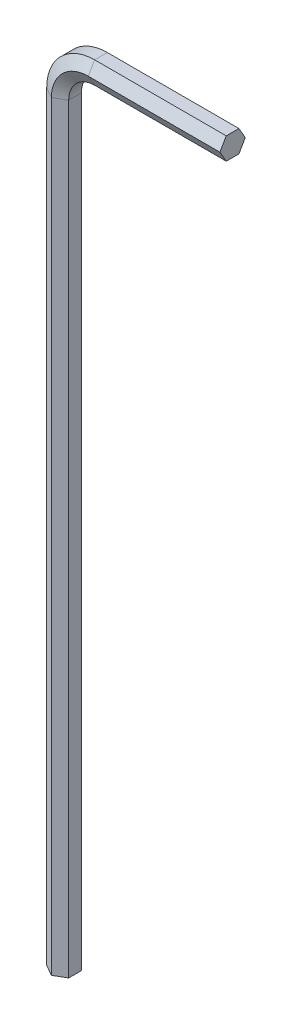
ISO-10303-21;
HEADER;
FILE_DESCRIPTION(('STEP AP214'),'2;1');
FILE_NAME('part.step','',(''),(''),'','','');
FILE_SCHEMA(('AUTOMOTIVE_DESIGN { 1 0 10303 214 1 1 1 1 }'));
ENDSEC;
DATA;
#1=APPLICATION_CONTEXT('core data for automotive mechanical design processes');
#2=APPLICATION_PROTOCOL_DEFINITION('international standard','automotive_design',2000,#1);
#3=PRODUCT_CONTEXT('',#1,'mechanical');
#4=PRODUCT('Part','Part','',(#3));
#5=PRODUCT_RELATED_PRODUCT_CATEGORY('part','',(#4));
#6=PRODUCT_DEFINITION_FORMATION('','',#4);
#7=PRODUCT_DEFINITION_CONTEXT('part definition',#1,'design');
#8=PRODUCT_DEFINITION('design','',#6,#7);
#9=PRODUCT_DEFINITION_SHAPE('','',#8);
#10=(LENGTH_UNIT() NAMED_UNIT(*) SI_UNIT(.MILLI.,.METRE.));
#11=(NAMED_UNIT(*) PLANE_ANGLE_UNIT() SI_UNIT($,.RADIAN.));
#12=(NAMED_UNIT(*) SI_UNIT($,.STERADIAN.) SOLID_ANGLE_UNIT());
#13=UNCERTAINTY_MEASURE_WITH_UNIT(LENGTH_MEASURE(1.E-05),#10,'distance_accuracy_value','');
#14=(GEOMETRIC_REPRESENTATION_CONTEXT(3) GLOBAL_UNCERTAINTY_ASSIGNED_CONTEXT((#13)) GLOBAL_UNIT_ASSIGNED_CONTEXT((#10,
#11,#12)) REPRESENTATION_CONTEXT('',''));
#15=CARTESIAN_POINT('',(0.,0.,0.));
#16=DIRECTION('',(0.,0.,1.));
#17=DIRECTION('',(1.,0.,0.));
#18=AXIS2_PLACEMENT_3D('',#15,#16,#17);
#19=CARTESIAN_POINT('',(4.00000000000003,86.31001,-1.37408209366592));
#20=DIRECTION('',(0.,0.500000000000001,-0.866025403784438));
#21=DIRECTION('',(0.,0.866025403784438,0.500000000000001));
#22=AXIS2_PLACEMENT_3D('',#19,#20,#21);
#23=PLANE('',#22);
#24=DIRECTION('',(0.,0.866025403784438,0.500000000000001));
#25=VECTOR('',#24,1.);
#26=CARTESIAN_POINT('',(4.00000000000003,86.31001,-1.37408209366592));
#27=LINE('',#26,#25);
#28=CARTESIAN_POINT('',(4.00000000000003,86.31001,-1.37408209366592));
#29=VERTEX_POINT('',#28);
#30=CARTESIAN_POINT('',(4.00000000000005,87.5,-0.687041046832959));
#31=VERTEX_POINT('',#30);
#32=EDGE_CURVE('E131',#29,#31,#27,.T.);
#33=ORIENTED_EDGE('',*,*,#32,.T.);
#34=DIRECTION('',(1.,0.,0.));
#35=VECTOR('',#34,1.);
#36=CARTESIAN_POINT('',(4.00000000000005,87.5,-0.687041046832959));
#37=LINE('',#36,#35);
#38=CARTESIAN_POINT('',(18.25001,87.5,-0.687041046832959));
#39=VERTEX_POINT('',#38);
#40=EDGE_CURVE('E40',#31,#39,#37,.T.);
#41=ORIENTED_EDGE('',*,*,#40,.T.);
#42=DIRECTION('',(0.,0.866025403784438,0.500000000000001));
#43=VECTOR('',#42,1.);
#44=CARTESIAN_POINT('',(18.25001,86.31001,-1.37408209366592));
#45=LINE('',#44,#43);
#46=CARTESIAN_POINT('',(18.25001,86.31001,-1.37408209366592));
#47=VERTEX_POINT('',#46);
#48=EDGE_CURVE('E47',#47,#39,#45,.T.);
#49=ORIENTED_EDGE('',*,*,#48,.F.);
#50=DIRECTION('',(1.,0.,0.));
#51=VECTOR('',#50,1.);
#52=CARTESIAN_POINT('',(4.00000000000003,86.31001,-1.37408209366592));
#53=LINE('',#52,#51);
#54=EDGE_CURVE('E11',#29,#47,#53,.T.);
#55=ORIENTED_EDGE('',*,*,#54,.F.);
#56=EDGE_LOOP('',(#33,#41,#49,#55));
#57=FACE_BOUND('',#56,.T.);
#58=ADVANCED_FACE('F33',(#57),#23,.T.);
#59=CARTESIAN_POINT('',(4.00000000000005,87.5,-0.687041046832959));
#60=DIRECTION('',(0.,1.,0.));
#61=DIRECTION('',(0.,0.,1.));
#62=AXIS2_PLACEMENT_3D('',#59,#60,#61);
#63=PLANE('',#62);
#64=DIRECTION('',(0.,0.,1.));
#65=VECTOR('',#64,1.);
#66=CARTESIAN_POINT('',(4.00000000000005,87.5,-0.687041046832959));
#67=LINE('',#66,#65);
#68=CARTESIAN_POINT('',(4.00000000000005,87.5,0.687041046832968));
#69=VERTEX_POINT('',#68);
#70=EDGE_CURVE('E178',#31,#69,#67,.T.);
#71=ORIENTED_EDGE('',*,*,#70,.T.);
#72=DIRECTION('',(1.,0.,0.));
#73=VECTOR('',#72,1.);
#74=CARTESIAN_POINT('',(4.00000000000005,87.5,0.687041046832968));
#75=LINE('',#74,#73);
#76=CARTESIAN_POINT('',(18.25001,87.5,0.687041046832968));
#77=VERTEX_POINT('',#76);
#78=EDGE_CURVE('E214',#69,#77,#75,.T.);
#79=ORIENTED_EDGE('',*,*,#78,.T.);
#80=DIRECTION('',(0.,0.,1.));
#81=VECTOR('',#80,1.);
#82=CARTESIAN_POINT('',(18.25001,87.5,-0.687041046832959));
#83=LINE('',#82,#81);
#84=EDGE_CURVE('E55',#39,#77,#83,.T.);
#85=ORIENTED_EDGE('',*,*,#84,.F.);
#86=ORIENTED_EDGE('',*,*,#40,.F.);
#87=EDGE_LOOP('',(#71,#79,#85,#86));
#88=FACE_BOUND('',#87,.T.);
#89=ADVANCED_FACE('F216',(#88),#63,.T.);
#90=CARTESIAN_POINT('',(4.00000000000005,87.5,0.687041046832968));
#91=DIRECTION('',(0.,0.499999999999995,0.866025403784441));
#92=DIRECTION('',(0.,-0.866025403784442,0.499999999999995));
#93=AXIS2_PLACEMENT_3D('',#90,#91,#92);
#94=PLANE('',#93);
#95=DIRECTION('',(0.,-0.866025403784442,0.499999999999995));
#96=VECTOR('',#95,1.);
#97=CARTESIAN_POINT('',(4.00000000000005,87.5,0.687041046832968));
#98=LINE('',#97,#96);
#99=CARTESIAN_POINT('',(4.00000000000003,86.31001,1.37408209366592));
#100=VERTEX_POINT('',#99);
#101=EDGE_CURVE('E175',#69,#100,#98,.T.);
#102=ORIENTED_EDGE('',*,*,#101,.T.);
#103=DIRECTION('',(1.,0.,0.));
#104=VECTOR('',#103,1.);
#105=CARTESIAN_POINT('',(4.00000000000003,86.31001,1.37408209366592));
#106=LINE('',#105,#104);
#107=CARTESIAN_POINT('',(18.25001,86.31001,1.37408209366592));
#108=VERTEX_POINT('',#107);
#109=EDGE_CURVE('E211',#100,#108,#106,.T.);
#110=ORIENTED_EDGE('',*,*,#109,.T.);
#111=DIRECTION('',(0.,-0.866025403784442,0.499999999999995));
#112=VECTOR('',#111,1.);
#113=CARTESIAN_POINT('',(18.25001,87.5,0.687041046832968));
#114=LINE('',#113,#112);
#115=EDGE_CURVE('E200',#77,#108,#114,.T.);
#116=ORIENTED_EDGE('',*,*,#115,.F.);
#117=ORIENTED_EDGE('',*,*,#78,.F.);
#118=EDGE_LOOP('',(#102,#110,#116,#117));
#119=FACE_BOUND('',#118,.T.);
#120=ADVANCED_FACE('F281',(#119),#94,.T.);
#121=CARTESIAN_POINT('',(4.00000000000003,86.31001,1.37408209366592));
#122=DIRECTION('',(0.,-0.500000000000007,0.866025403784435));
#123=DIRECTION('',(0.,-0.866025403784435,-0.500000000000007));
#124=AXIS2_PLACEMENT_3D('',#121,#122,#123);
#125=PLANE('',#124);
#126=DIRECTION('',(0.,-0.866025403784435,-0.500000000000007));
#127=VECTOR('',#126,1.);
#128=CARTESIAN_POINT('',(4.00000000000003,86.31001,1.37408209366592));
#129=LINE('',#128,#127);
#130=CARTESIAN_POINT('',(4.00000000000002,85.12002,0.687041046832951));
#131=VERTEX_POINT('',#130);
#132=EDGE_CURVE('E172',#100,#131,#129,.T.);
#133=ORIENTED_EDGE('',*,*,#132,.T.);
#134=DIRECTION('',(1.,0.,0.));
#135=VECTOR('',#134,1.);
#136=CARTESIAN_POINT('',(4.00000000000002,85.12002,0.687041046832951));
#137=LINE('',#136,#135);
#138=CARTESIAN_POINT('',(18.25001,85.12002,0.687041046832951));
#139=VERTEX_POINT('',#138);
#140=EDGE_CURVE('E208',#131,#139,#137,.T.);
#141=ORIENTED_EDGE('',*,*,#140,.T.);
#142=DIRECTION('',(0.,-0.866025403784435,-0.500000000000007));
#143=VECTOR('',#142,1.);
#144=CARTESIAN_POINT('',(18.25001,86.31001,1.37408209366592));
#145=LINE('',#144,#143);
#146=EDGE_CURVE('E197',#108,#139,#145,.T.);
#147=ORIENTED_EDGE('',*,*,#146,.F.);
#148=ORIENTED_EDGE('',*,*,#109,.F.);
#149=EDGE_LOOP('',(#133,#141,#147,#148));
#150=FACE_BOUND('',#149,.T.);
#151=ADVANCED_FACE('F280',(#150),#125,.T.);
#152=CARTESIAN_POINT('',(4.00000000000002,85.12002,0.687041046832951));
#153=DIRECTION('',(0.,-1.,0.));
#154=DIRECTION('',(0.,0.,-1.));
#155=AXIS2_PLACEMENT_3D('',#152,#153,#154);
#156=PLANE('',#155);
#157=DIRECTION('',(0.,0.,-1.));
#158=VECTOR('',#157,1.);
#159=CARTESIAN_POINT('',(4.00000000000002,85.12002,0.687041046832951));
#160=LINE('',#159,#158);
#161=CARTESIAN_POINT('',(4.00000000000002,85.12002,-0.687041046832976));
#162=VERTEX_POINT('',#161);
#163=EDGE_CURVE('E164',#131,#162,#160,.T.);
#164=ORIENTED_EDGE('',*,*,#163,.T.);
#165=DIRECTION('',(1.,0.,0.));
#166=VECTOR('',#165,1.);
#167=CARTESIAN_POINT('',(4.00000000000002,85.12002,-0.687041046832976));
#168=LINE('',#167,#166);
#169=CARTESIAN_POINT('',(18.25001,85.12002,-0.687041046832976));
#170=VERTEX_POINT('',#169);
#171=EDGE_CURVE('E205',#162,#170,#168,.T.);
#172=ORIENTED_EDGE('',*,*,#171,.T.);
#173=DIRECTION('',(0.,0.,-1.));
#174=VECTOR('',#173,1.);
#175=CARTESIAN_POINT('',(18.25001,85.12002,0.687041046832951));
#176=LINE('',#175,#174);
#177=EDGE_CURVE('E194',#139,#170,#176,.T.);
#178=ORIENTED_EDGE('',*,*,#177,.F.);
#179=ORIENTED_EDGE('',*,*,#140,.F.);
#180=EDGE_LOOP('',(#164,#172,#178,#179));
#181=FACE_BOUND('',#180,.T.);
#182=ADVANCED_FACE('F287',(#181),#156,.T.);
#183=CARTESIAN_POINT('',(4.00000000000002,85.12002,-0.687041046832976));
#184=DIRECTION('',(0.,-0.499999999999995,-0.866025403784441));
#185=DIRECTION('',(0.,0.866025403784442,-0.499999999999995));
#186=AXIS2_PLACEMENT_3D('',#183,#184,#185);
#187=PLANE('',#186);
#188=DIRECTION('',(0.,0.866025403784442,-0.499999999999995));
#189=VECTOR('',#188,1.);
#190=CARTESIAN_POINT('',(4.00000000000002,85.12002,-0.687041046832976));
#191=LINE('',#190,#189);
#192=EDGE_CURVE('E161',#162,#29,#191,.T.);
#193=ORIENTED_EDGE('',*,*,#192,.T.);
#194=ORIENTED_EDGE('',*,*,#54,.T.);
#195=DIRECTION('',(0.,0.866025403784442,-0.499999999999995));
#196=VECTOR('',#195,1.);
#197=CARTESIAN_POINT('',(18.25001,85.12002,-0.687041046832976));
#198=LINE('',#197,#196);
#199=EDGE_CURVE('E134',#170,#47,#198,.T.);
#200=ORIENTED_EDGE('',*,*,#199,.F.);
#201=ORIENTED_EDGE('',*,*,#171,.F.);
#202=EDGE_LOOP('',(#193,#194,#200,#201));
#203=FACE_BOUND('',#202,.T.);
#204=ADVANCED_FACE('F285',(#203),#187,.T.);
#205=CARTESIAN_POINT('',(4.,82.31001,-1.37408209366592));
#206=DIRECTION('',(0.,0.,1.));
#207=DIRECTION('',(1.,0.,0.));
#208=AXIS2_PLACEMENT_3D('',#205,#206,#207);
#209=CONICAL_SURFACE('',#208,4.,1.0471975511966);
#210=DIRECTION('',(-0.866025403784438,0.,0.500000000000001));
#211=VECTOR('',#210,1.);
#212=CARTESIAN_POINT('',(0.,82.31001,-1.37408209366592));
#213=LINE('',#212,#211);
#214=CARTESIAN_POINT('',(0.,82.31001,-1.37408209366592));
#215=VERTEX_POINT('',#214);
#216=CARTESIAN_POINT('',(-1.18999,82.31001,-0.687041046832959));
#217=VERTEX_POINT('',#216);
#218=EDGE_CURVE('E128',#215,#217,#213,.T.);
#219=ORIENTED_EDGE('',*,*,#218,.T.);
#220=CARTESIAN_POINT('',(4.,82.31001,-0.687041046832959));
#221=DIRECTION('',(0.,0.,-1.));
#222=DIRECTION('',(-1.,0.,0.));
#223=AXIS2_PLACEMENT_3D('',#220,#221,#222);
#224=CIRCLE('',#223,5.18999);
#225=EDGE_CURVE('E135',#217,#31,#224,.T.);
#226=ORIENTED_EDGE('',*,*,#225,.T.);
#227=ORIENTED_EDGE('',*,*,#32,.F.);
#228=CARTESIAN_POINT('',(4.,82.31001,-1.37408209366592));
#229=DIRECTION('',(0.,0.,-1.));
#230=DIRECTION('',(-1.,0.,0.));
#231=AXIS2_PLACEMENT_3D('',#228,#229,#230);
#232=CIRCLE('',#231,4.);
#233=EDGE_CURVE('E123',#215,#29,#232,.T.);
#234=ORIENTED_EDGE('',*,*,#233,.F.);
#235=EDGE_LOOP('',(#219,#226,#227,#234));
#236=FACE_BOUND('',#235,.T.);
#237=ADVANCED_FACE('F125',(#236),#209,.T.);
#238=CARTESIAN_POINT('',(4.,82.31001,0.));
#239=DIRECTION('',(0.,0.,-1.));
#240=DIRECTION('',(-1.,0.,0.));
#241=AXIS2_PLACEMENT_3D('',#238,#239,#240);
#242=CYLINDRICAL_SURFACE('',#241,5.18999);
#243=DIRECTION('',(0.,0.,1.));
#244=VECTOR('',#243,1.);
#245=CARTESIAN_POINT('',(-1.18999,82.31001,-0.687041046832959));
#246=LINE('',#245,#244);
#247=CARTESIAN_POINT('',(-1.18999,82.31001,0.687041046832968));
#248=VERTEX_POINT('',#247);
#249=EDGE_CURVE('E156',#217,#248,#246,.T.);
#250=ORIENTED_EDGE('',*,*,#249,.T.);
#251=CARTESIAN_POINT('',(4.,82.31001,0.687041046832968));
#252=DIRECTION('',(0.,0.,-1.));
#253=DIRECTION('',(-1.,0.,0.));
#254=AXIS2_PLACEMENT_3D('',#251,#252,#253);
#255=CIRCLE('',#254,5.18999);
#256=EDGE_CURVE('E189',#248,#69,#255,.T.);
#257=ORIENTED_EDGE('',*,*,#256,.T.);
#258=ORIENTED_EDGE('',*,*,#70,.F.);
#259=ORIENTED_EDGE('',*,*,#225,.F.);
#260=EDGE_LOOP('',(#250,#257,#258,#259));
#261=FACE_BOUND('',#260,.T.);
#262=ADVANCED_FACE('F225',(#261),#242,.T.);
#263=CARTESIAN_POINT('',(4.,82.31001,0.687041046832968));
#264=DIRECTION('',(0.,0.,-1.));
#265=DIRECTION('',(-1.,0.,0.));
#266=AXIS2_PLACEMENT_3D('',#263,#264,#265);
#267=CONICAL_SURFACE('',#266,5.18999,1.0471975511966);
#268=DIRECTION('',(0.866025403784442,0.,0.499999999999995));
#269=VECTOR('',#268,1.);
#270=CARTESIAN_POINT('',(-1.18999,82.31001,0.687041046832968));
#271=LINE('',#270,#269);
#272=CARTESIAN_POINT('',(0.,82.31001,1.37408209366592));
#273=VERTEX_POINT('',#272);
#274=EDGE_CURVE('E228',#248,#273,#271,.T.);
#275=ORIENTED_EDGE('',*,*,#274,.T.);
#276=CARTESIAN_POINT('',(4.,82.31001,1.37408209366592));
#277=DIRECTION('',(0.,0.,-1.));
#278=DIRECTION('',(-1.,0.,0.));
#279=AXIS2_PLACEMENT_3D('',#276,#277,#278);
#280=CIRCLE('',#279,3.99999999999999);
#281=EDGE_CURVE('E186',#273,#100,#280,.T.);
#282=ORIENTED_EDGE('',*,*,#281,.T.);
#283=ORIENTED_EDGE('',*,*,#101,.F.);
#284=ORIENTED_EDGE('',*,*,#256,.F.);
#285=EDGE_LOOP('',(#275,#282,#283,#284));
#286=FACE_BOUND('',#285,.T.);
#287=ADVANCED_FACE('F221',(#286),#267,.T.);
#288=CARTESIAN_POINT('',(4.,82.31001,1.37408209366592));
#289=DIRECTION('',(0.,0.,1.));
#290=DIRECTION('',(1.,0.,0.));
#291=AXIS2_PLACEMENT_3D('',#288,#289,#290);
#292=CONICAL_SURFACE('',#291,3.99999999999999,1.04719755119659);
#293=DIRECTION('',(0.866025403784435,0.,-0.500000000000007));
#294=VECTOR('',#293,1.);
#295=CARTESIAN_POINT('',(0.,82.31001,1.37408209366592));
#296=LINE('',#295,#294);
#297=CARTESIAN_POINT('',(1.18999000000001,82.31001,0.687041046832951));
#298=VERTEX_POINT('',#297);
#299=EDGE_CURVE('E242',#273,#298,#296,.T.);
#300=ORIENTED_EDGE('',*,*,#299,.T.);
#301=CARTESIAN_POINT('',(4.,82.31001,0.687041046832951));
#302=DIRECTION('',(0.,0.,-1.));
#303=DIRECTION('',(-1.,0.,0.));
#304=AXIS2_PLACEMENT_3D('',#301,#302,#303);
#305=CIRCLE('',#304,2.81000999999999);
#306=EDGE_CURVE('E183',#298,#131,#305,.T.);
#307=ORIENTED_EDGE('',*,*,#306,.T.);
#308=ORIENTED_EDGE('',*,*,#132,.F.);
#309=ORIENTED_EDGE('',*,*,#281,.F.);
#310=EDGE_LOOP('',(#300,#307,#308,#309));
#311=FACE_BOUND('',#310,.T.);
#312=ADVANCED_FACE('F278',(#311),#292,.F.);
#313=CARTESIAN_POINT('',(4.,82.31001,0.));
#314=DIRECTION('',(0.,0.,-1.));
#315=DIRECTION('',(-1.,0.,0.));
#316=AXIS2_PLACEMENT_3D('',#313,#314,#315);
#317=CYLINDRICAL_SURFACE('',#316,2.81001);
#318=DIRECTION('',(0.,0.,-1.));
#319=VECTOR('',#318,1.);
#320=CARTESIAN_POINT('',(1.18999000000001,82.31001,0.687041046832951));
#321=LINE('',#320,#319);
#322=CARTESIAN_POINT('',(1.18998999999999,82.31001,-0.687041046832976));
#323=VERTEX_POINT('',#322);
#324=EDGE_CURVE('E245',#298,#323,#321,.T.);
#325=ORIENTED_EDGE('',*,*,#324,.T.);
#326=CARTESIAN_POINT('',(4.,82.31001,-0.687041046832976));
#327=DIRECTION('',(0.,0.,-1.));
#328=DIRECTION('',(-1.,0.,0.));
#329=AXIS2_PLACEMENT_3D('',#326,#327,#328);
#330=CIRCLE('',#329,2.81001000000001);
#331=EDGE_CURVE('E141',#323,#162,#330,.T.);
#332=ORIENTED_EDGE('',*,*,#331,.T.);
#333=ORIENTED_EDGE('',*,*,#163,.F.);
#334=ORIENTED_EDGE('',*,*,#306,.F.);
#335=EDGE_LOOP('',(#325,#332,#333,#334));
#336=FACE_BOUND('',#335,.T.);
#337=ADVANCED_FACE('F275',(#336),#317,.F.);
#338=CARTESIAN_POINT('',(4.,82.31001,-0.687041046832976));
#339=DIRECTION('',(0.,0.,-1.));
#340=DIRECTION('',(-1.,0.,0.));
#341=AXIS2_PLACEMENT_3D('',#338,#339,#340);
#342=CONICAL_SURFACE('',#341,2.81001000000001,1.0471975511966);
#343=DIRECTION('',(-0.866025403784442,0.,-0.499999999999995));
#344=VECTOR('',#343,1.);
#345=CARTESIAN_POINT('',(1.18998999999999,82.31001,-0.687041046832976));
#346=LINE('',#345,#344);
#347=EDGE_CURVE('E138',#323,#215,#346,.T.);
#348=ORIENTED_EDGE('',*,*,#347,.T.);
#349=ORIENTED_EDGE('',*,*,#233,.T.);
#350=ORIENTED_EDGE('',*,*,#192,.F.);
#351=ORIENTED_EDGE('',*,*,#331,.F.);
#352=EDGE_LOOP('',(#348,#349,#350,#351));
#353=FACE_BOUND('',#352,.T.);
#354=ADVANCED_FACE('F139',(#353),#342,.F.);
#355=CARTESIAN_POINT('',(1.18998999999999,82.31001,-0.687041046832976));
#356=DIRECTION('',(-0.499999999999995,0.,0.866025403784441));
#357=DIRECTION('',(0.866025403784442,0.,0.499999999999995));
#358=AXIS2_PLACEMENT_3D('',#355,#356,#357);
#359=PLANE('',#358);
#360=DIRECTION('',(-0.866025403784442,0.,-0.499999999999995));
#361=VECTOR('',#360,1.);
#362=CARTESIAN_POINT('',(1.18998999999999,0.,-0.687041046832976));
#363=LINE('',#362,#361);
#364=CARTESIAN_POINT('',(1.18998999999999,0.,-0.687041046832976));
#365=VERTEX_POINT('',#364);
#366=CARTESIAN_POINT('',(0.,0.,-1.37408209366592));
#367=VERTEX_POINT('',#366);
#368=EDGE_CURVE('E160',#365,#367,#363,.T.);
#369=ORIENTED_EDGE('',*,*,#368,.T.);
#370=DIRECTION('',(0.,-1.,0.));
#371=VECTOR('',#370,1.);
#372=CARTESIAN_POINT('',(0.,82.31001,-1.37408209366592));
#373=LINE('',#372,#371);
#374=EDGE_CURVE('E151',#215,#367,#373,.T.);
#375=ORIENTED_EDGE('',*,*,#374,.F.);
#376=ORIENTED_EDGE('',*,*,#347,.F.);
#377=DIRECTION('',(0.,-1.,0.));
#378=VECTOR('',#377,1.);
#379=CARTESIAN_POINT('',(1.18998999999999,82.31001,-0.687041046832976));
#380=LINE('',#379,#378);
#381=EDGE_CURVE('E249',#323,#365,#380,.T.);
#382=ORIENTED_EDGE('',*,*,#381,.T.);
#383=EDGE_LOOP('',(#369,#375,#376,#382));
#384=FACE_BOUND('',#383,.T.);
#385=ADVANCED_FACE('F158',(#384),#359,.F.);
#386=CARTESIAN_POINT('',(0.,82.31001,-1.37408209366592));
#387=DIRECTION('',(0.500000000000001,0.,0.866025403784438));
#388=DIRECTION('',(0.866025403784438,0.,-0.500000000000001));
#389=AXIS2_PLACEMENT_3D('',#386,#387,#388);
#390=PLANE('',#389);
#391=DIRECTION('',(-0.866025403784438,0.,0.500000000000001));
#392=VECTOR('',#391,1.);
#393=CARTESIAN_POINT('',(0.,0.,-1.37408209366592));
#394=LINE('',#393,#392);
#395=CARTESIAN_POINT('',(-1.18999,0.,-0.687041046832959));
#396=VERTEX_POINT('',#395);
#397=EDGE_CURVE('E251',#367,#396,#394,.T.);
#398=ORIENTED_EDGE('',*,*,#397,.T.);
#399=DIRECTION('',(0.,-1.,0.));
#400=VECTOR('',#399,1.);
#401=CARTESIAN_POINT('',(-1.18999,82.31001,-0.687041046832959));
#402=LINE('',#401,#400);
#403=EDGE_CURVE('E154',#217,#396,#402,.T.);
#404=ORIENTED_EDGE('',*,*,#403,.F.);
#405=ORIENTED_EDGE('',*,*,#218,.F.);
#406=ORIENTED_EDGE('',*,*,#374,.T.);
#407=EDGE_LOOP('',(#398,#404,#405,#406));
#408=FACE_BOUND('',#407,.T.);
#409=ADVANCED_FACE('F150',(#408),#390,.F.);
#410=CARTESIAN_POINT('',(-1.18999,82.31001,-0.687041046832959));
#411=DIRECTION('',(1.,0.,0.));
#412=DIRECTION('',(0.,0.,-1.));
#413=AXIS2_PLACEMENT_3D('',#410,#411,#412);
#414=PLANE('',#413);
#415=DIRECTION('',(0.,0.,1.));
#416=VECTOR('',#415,1.);
#417=CARTESIAN_POINT('',(-1.18999,0.,-0.687041046832959));
#418=LINE('',#417,#416);
#419=CARTESIAN_POINT('',(-1.18999,0.,0.687041046832968));
#420=VERTEX_POINT('',#419);
#421=EDGE_CURVE('E234',#396,#420,#418,.T.);
#422=ORIENTED_EDGE('',*,*,#421,.T.);
#423=DIRECTION('',(0.,-1.,0.));
#424=VECTOR('',#423,1.);
#425=CARTESIAN_POINT('',(-1.18999,82.31001,0.687041046832968));
#426=LINE('',#425,#424);
#427=EDGE_CURVE('E166',#248,#420,#426,.T.);
#428=ORIENTED_EDGE('',*,*,#427,.F.);
#429=ORIENTED_EDGE('',*,*,#249,.F.);
#430=ORIENTED_EDGE('',*,*,#403,.T.);
#431=EDGE_LOOP('',(#422,#428,#429,#430));
#432=FACE_BOUND('',#431,.T.);
#433=ADVANCED_FACE('F232',(#432),#414,.F.);
#434=CARTESIAN_POINT('',(-1.18999,82.31001,0.687041046832968));
#435=DIRECTION('',(0.499999999999995,0.,-0.866025403784441));
#436=DIRECTION('',(-0.866025403784442,0.,-0.499999999999995));
#437=AXIS2_PLACEMENT_3D('',#434,#435,#436);
#438=PLANE('',#437);
#439=DIRECTION('',(0.866025403784442,0.,0.499999999999995));
#440=VECTOR('',#439,1.);
#441=CARTESIAN_POINT('',(-1.18999,0.,0.687041046832968));
#442=LINE('',#441,#440);
#443=CARTESIAN_POINT('',(0.,0.,1.37408209366592));
#444=VERTEX_POINT('',#443);
#445=EDGE_CURVE('E254',#420,#444,#442,.T.);
#446=ORIENTED_EDGE('',*,*,#445,.T.);
#447=DIRECTION('',(0.,-1.,0.));
#448=VECTOR('',#447,1.);
#449=CARTESIAN_POINT('',(0.,82.31001,1.37408209366592));
#450=LINE('',#449,#448);
#451=EDGE_CURVE('E237',#273,#444,#450,.T.);
#452=ORIENTED_EDGE('',*,*,#451,.F.);
#453=ORIENTED_EDGE('',*,*,#274,.F.);
#454=ORIENTED_EDGE('',*,*,#427,.T.);
#455=EDGE_LOOP('',(#446,#452,#453,#454));
#456=FACE_BOUND('',#455,.T.);
#457=ADVANCED_FACE('F239',(#456),#438,.F.);
#458=CARTESIAN_POINT('',(0.,82.31001,1.37408209366592));
#459=DIRECTION('',(-0.500000000000007,0.,-0.866025403784434));
#460=DIRECTION('',(-0.866025403784435,0.,0.500000000000007));
#461=AXIS2_PLACEMENT_3D('',#458,#459,#460);
#462=PLANE('',#461);
#463=DIRECTION('',(0.866025403784435,0.,-0.500000000000007));
#464=VECTOR('',#463,1.);
#465=CARTESIAN_POINT('',(0.,0.,1.37408209366592));
#466=LINE('',#465,#464);
#467=CARTESIAN_POINT('',(1.18999000000001,0.,0.687041046832951));
#468=VERTEX_POINT('',#467);
#469=EDGE_CURVE('E256',#444,#468,#466,.T.);
#470=ORIENTED_EDGE('',*,*,#469,.T.);
#471=DIRECTION('',(0.,-1.,0.));
#472=VECTOR('',#471,1.);
#473=CARTESIAN_POINT('',(1.18999000000001,82.31001,0.687041046832951));
#474=LINE('',#473,#472);
#475=EDGE_CURVE('E260',#298,#468,#474,.T.);
#476=ORIENTED_EDGE('',*,*,#475,.F.);
#477=ORIENTED_EDGE('',*,*,#299,.F.);
#478=ORIENTED_EDGE('',*,*,#451,.T.);
#479=EDGE_LOOP('',(#470,#476,#477,#478));
#480=FACE_BOUND('',#479,.T.);
#481=ADVANCED_FACE('F265',(#480),#462,.F.);
#482=CARTESIAN_POINT('',(1.18999000000001,82.31001,0.687041046832951));
#483=DIRECTION('',(-1.,0.,0.));
#484=DIRECTION('',(0.,0.,1.));
#485=AXIS2_PLACEMENT_3D('',#482,#483,#484);
#486=PLANE('',#485);
#487=DIRECTION('',(0.,0.,-1.));
#488=VECTOR('',#487,1.);
#489=CARTESIAN_POINT('',(1.18999000000001,0.,0.687041046832951));
#490=LINE('',#489,#488);
#491=EDGE_CURVE('E146',#468,#365,#490,.T.);
#492=ORIENTED_EDGE('',*,*,#491,.T.);
#493=ORIENTED_EDGE('',*,*,#381,.F.);
#494=ORIENTED_EDGE('',*,*,#324,.F.);
#495=ORIENTED_EDGE('',*,*,#475,.T.);
#496=EDGE_LOOP('',(#492,#493,#494,#495));
#497=FACE_BOUND('',#496,.T.);
#498=ADVANCED_FACE('F272',(#497),#486,.F.);
#499=CARTESIAN_POINT('',(18.25001,86.31001,0.));
#500=DIRECTION('',(1.,0.,0.));
#501=DIRECTION('',(0.,0.,1.));
#502=AXIS2_PLACEMENT_3D('',#499,#500,#501);
#503=PLANE('',#502);
#504=ORIENTED_EDGE('',*,*,#199,.T.);
#505=ORIENTED_EDGE('',*,*,#48,.T.);
#506=ORIENTED_EDGE('',*,*,#84,.T.);
#507=ORIENTED_EDGE('',*,*,#115,.T.);
#508=ORIENTED_EDGE('',*,*,#146,.T.);
#509=ORIENTED_EDGE('',*,*,#177,.T.);
#510=EDGE_LOOP('',(#504,#505,#506,#507,#508,#509));
#511=FACE_BOUND('',#510,.T.);
#512=ADVANCED_FACE('F283',(#511),#503,.T.);
#513=CARTESIAN_POINT('',(0.,0.,0.));
#514=DIRECTION('',(0.,1.,0.));
#515=DIRECTION('',(0.,0.,1.));
#516=AXIS2_PLACEMENT_3D('',#513,#514,#515);
#517=PLANE('',#516);
#518=ORIENTED_EDGE('',*,*,#368,.F.);
#519=ORIENTED_EDGE('',*,*,#491,.F.);
#520=ORIENTED_EDGE('',*,*,#469,.F.);
#521=ORIENTED_EDGE('',*,*,#445,.F.);
#522=ORIENTED_EDGE('',*,*,#421,.F.);
#523=ORIENTED_EDGE('',*,*,#397,.F.);
#524=EDGE_LOOP('',(#518,#519,#520,#521,#522,#523));
#525=FACE_BOUND('',#524,.T.);
#526=ADVANCED_FACE('F269',(#525),#517,.F.);
#527=CLOSED_SHELL('',(#58,#89,#120,#151,#182,#204,#237,#262,#287,#312,#337,#354,#385,#409,#433,
#457,#481,#498,#512,#526));
#528=MANIFOLD_SOLID_BREP('B2',#527);
#529=ADVANCED_BREP_SHAPE_REPRESENTATION('',(#18,#528),#14);
#530=SHAPE_DEFINITION_REPRESENTATION(#9,#529);
ENDSEC;
END-ISO-10303-21;
